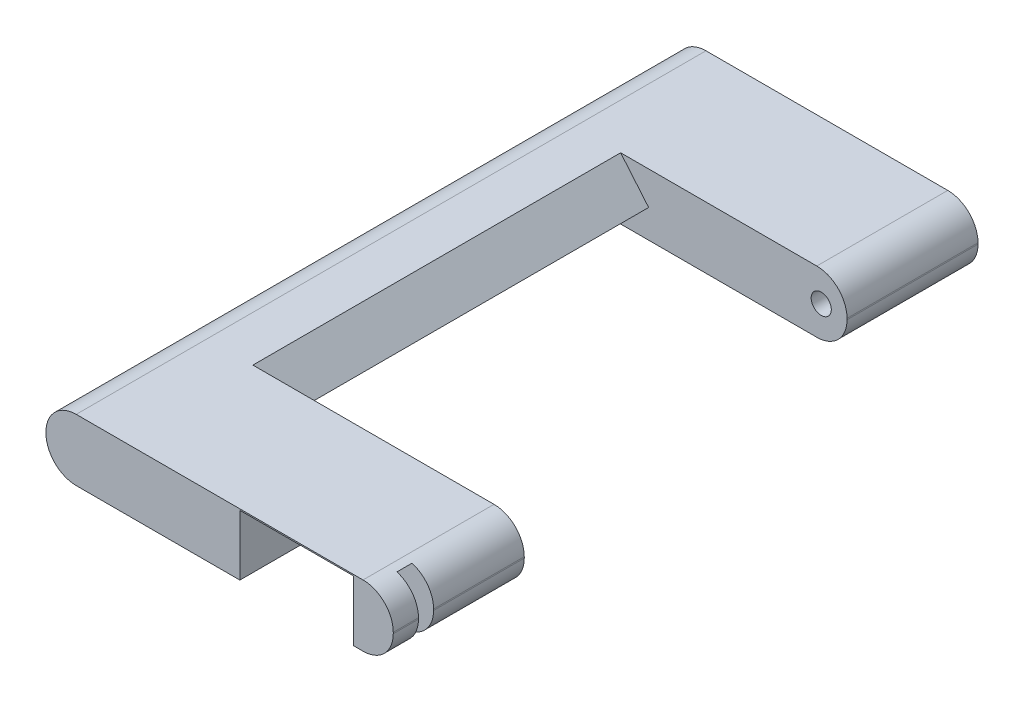
ISO-10303-21;
HEADER;
FILE_DESCRIPTION(('STEP AP214'),'2;1');
FILE_NAME('part.step','',(''),(''),'','','');
FILE_SCHEMA(('AUTOMOTIVE_DESIGN { 1 0 10303 214 1 1 1 1 }'));
ENDSEC;
DATA;
#1=APPLICATION_CONTEXT('core data for automotive mechanical design processes');
#2=APPLICATION_PROTOCOL_DEFINITION('international standard','automotive_design',2000,#1);
#3=PRODUCT_CONTEXT('',#1,'mechanical');
#4=PRODUCT('Part','Part','',(#3));
#5=PRODUCT_RELATED_PRODUCT_CATEGORY('part','',(#4));
#6=PRODUCT_DEFINITION_FORMATION('','',#4);
#7=PRODUCT_DEFINITION_CONTEXT('part definition',#1,'design');
#8=PRODUCT_DEFINITION('design','',#6,#7);
#9=PRODUCT_DEFINITION_SHAPE('','',#8);
#10=(LENGTH_UNIT() NAMED_UNIT(*) SI_UNIT(.MILLI.,.METRE.));
#11=(NAMED_UNIT(*) PLANE_ANGLE_UNIT() SI_UNIT($,.RADIAN.));
#12=(NAMED_UNIT(*) SI_UNIT($,.STERADIAN.) SOLID_ANGLE_UNIT());
#13=UNCERTAINTY_MEASURE_WITH_UNIT(LENGTH_MEASURE(1.E-05),#10,'distance_accuracy_value','');
#14=(GEOMETRIC_REPRESENTATION_CONTEXT(3) GLOBAL_UNCERTAINTY_ASSIGNED_CONTEXT((#13)) GLOBAL_UNIT_ASSIGNED_CONTEXT((#10,
#11,#12)) REPRESENTATION_CONTEXT('',''));
#15=CARTESIAN_POINT('',(0.,0.,0.));
#16=DIRECTION('',(0.,0.,1.));
#17=DIRECTION('',(1.,0.,0.));
#18=AXIS2_PLACEMENT_3D('',#15,#16,#17);
#19=CARTESIAN_POINT('',(19.1500000000003,6.05000000000089,-9.00000000000002));
#20=DIRECTION('',(-1.,0.,0.));
#21=DIRECTION('',(0.,0.,1.));
#22=AXIS2_PLACEMENT_3D('',#19,#20,#21);
#23=PLANE('',#22);
#24=DIRECTION('',(0.,0.,1.));
#25=VECTOR('',#24,1.);
#26=CARTESIAN_POINT('',(19.1500000000003,-0.203553390593287,-9.00000000000002));
#27=LINE('',#26,#25);
#28=CARTESIAN_POINT('',(19.1500000000003,-0.203553390593287,17.));
#29=VERTEX_POINT('',#28);
#30=CARTESIAN_POINT('',(19.1500000000003,-0.203553390593286,12.0000000000001));
#31=VERTEX_POINT('',#30);
#32=EDGE_CURVE('E350',#29,#31,#27,.F.);
#33=ORIENTED_EDGE('',*,*,#32,.T.);
#34=DIRECTION('',(0.,-1.,0.));
#35=VECTOR('',#34,1.);
#36=CARTESIAN_POINT('',(19.1500000000003,5.79644660940673,12.0000000000001));
#37=LINE('',#36,#35);
#38=CARTESIAN_POINT('',(19.1500000000003,0.0500000000008887,12.0000000000001));
#39=VERTEX_POINT('',#38);
#40=EDGE_CURVE('E257',#39,#31,#37,.T.);
#41=ORIENTED_EDGE('',*,*,#40,.F.);
#42=DIRECTION('',(0.,0.,1.));
#43=VECTOR('',#42,1.);
#44=CARTESIAN_POINT('',(19.1500000000003,0.0500000000008879,17.));
#45=LINE('',#44,#43);
#46=CARTESIAN_POINT('',(19.1500000000003,0.0500000000008879,17.));
#47=VERTEX_POINT('',#46);
#48=EDGE_CURVE('E353',#39,#47,#45,.T.);
#49=ORIENTED_EDGE('',*,*,#48,.T.);
#50=DIRECTION('',(0.,-1.,0.));
#51=VECTOR('',#50,1.);
#52=CARTESIAN_POINT('',(19.1500000000003,6.05000000000089,17.));
#53=LINE('',#52,#51);
#54=EDGE_CURVE('E292',#47,#29,#53,.T.);
#55=ORIENTED_EDGE('',*,*,#54,.T.);
#56=EDGE_LOOP('',(#33,#41,#49,#55));
#57=FACE_BOUND('',#56,.T.);
#58=ADVANCED_FACE('F32',(#57),#23,.F.);
#59=CARTESIAN_POINT('',(19.1500000000003,-6.20355339059329,-9.00000000000002));
#60=DIRECTION('',(0.,1.,0.));
#61=DIRECTION('',(-1.,0.,0.));
#62=AXIS2_PLACEMENT_3D('',#59,#60,#61);
#63=PLANE('',#62);
#64=DIRECTION('',(-1.,0.,0.));
#65=VECTOR('',#64,1.);
#66=CARTESIAN_POINT('',(19.1500000000003,-6.20355339059329,17.));
#67=LINE('',#66,#65);
#68=CARTESIAN_POINT('',(13.1500000000003,-6.20355339059329,17.));
#69=VERTEX_POINT('',#68);
#70=CARTESIAN_POINT('',(11.3000000000003,-6.20355339059329,17.));
#71=VERTEX_POINT('',#70);
#72=EDGE_CURVE('E296',#69,#71,#67,.T.);
#73=ORIENTED_EDGE('',*,*,#72,.T.);
#74=DIRECTION('',(0.,0.,1.));
#75=VECTOR('',#74,1.);
#76=CARTESIAN_POINT('',(11.3000000000003,-6.20355339059329,12.0000000000001));
#77=LINE('',#76,#75);
#78=CARTESIAN_POINT('',(11.3000000000003,-6.20355339059329,12.0000000000001));
#79=VERTEX_POINT('',#78);
#80=EDGE_CURVE('E227',#79,#71,#77,.T.);
#81=ORIENTED_EDGE('',*,*,#80,.F.);
#82=DIRECTION('',(-1.,0.,0.));
#83=VECTOR('',#82,1.);
#84=CARTESIAN_POINT('',(11.3000000000003,-6.20355339059329,12.0000000000001));
#85=LINE('',#84,#83);
#86=CARTESIAN_POINT('',(13.1500000000003,-6.20355339059329,12.0000000000001));
#87=VERTEX_POINT('',#86);
#88=EDGE_CURVE('E243',#87,#79,#85,.T.);
#89=ORIENTED_EDGE('',*,*,#88,.F.);
#90=DIRECTION('',(0.,0.,1.));
#91=VECTOR('',#90,1.);
#92=CARTESIAN_POINT('',(13.1500000000003,-6.20355339059329,-9.00000000000002));
#93=LINE('',#92,#91);
#94=EDGE_CURVE('E384',#87,#69,#93,.T.);
#95=ORIENTED_EDGE('',*,*,#94,.T.);
#96=EDGE_LOOP('',(#73,#81,#89,#95));
#97=FACE_BOUND('',#96,.T.);
#98=ADVANCED_FACE('F400',(#97),#63,.F.);
#99=CARTESIAN_POINT('',(13.1500000000003,-0.203553390593288,-9.00000000000002));
#100=DIRECTION('',(0.,0.,1.));
#101=DIRECTION('',(1.,0.,0.));
#102=AXIS2_PLACEMENT_3D('',#99,#100,#101);
#103=CYLINDRICAL_SURFACE('',#102,6.);
#104=CARTESIAN_POINT('',(13.1500000000003,-0.203553390593288,12.0000000000001));
#105=DIRECTION('',(0.,0.,1.));
#106=DIRECTION('',(1.,0.,0.));
#107=AXIS2_PLACEMENT_3D('',#104,#105,#106);
#108=CIRCLE('',#107,6.);
#109=EDGE_CURVE('E40',#31,#87,#108,.F.);
#110=ORIENTED_EDGE('',*,*,#109,.F.);
#111=ORIENTED_EDGE('',*,*,#32,.F.);
#112=CARTESIAN_POINT('',(13.1500000000003,-0.203553390593288,17.));
#113=DIRECTION('',(0.,0.,-1.));
#114=DIRECTION('',(-1.,0.,0.));
#115=AXIS2_PLACEMENT_3D('',#112,#113,#114);
#116=CIRCLE('',#115,6.);
#117=EDGE_CURVE('E357',#69,#29,#116,.F.);
#118=ORIENTED_EDGE('',*,*,#117,.F.);
#119=ORIENTED_EDGE('',*,*,#94,.F.);
#120=EDGE_LOOP('',(#110,#111,#118,#119));
#121=FACE_BOUND('',#120,.T.);
#122=ADVANCED_FACE('F402',(#121),#103,.T.);
#123=CARTESIAN_POINT('',(19.1500000000003,0.0500000000008879,-9.00000000000002));
#124=VERTEX_POINT('',#123);
#125=CARTESIAN_POINT('',(19.1500000000003,0.050000000000889,9.00000000000006));
#126=VERTEX_POINT('',#125);
#127=EDGE_CURVE('E354',#124,#126,#45,.T.);
#128=ORIENTED_EDGE('',*,*,#127,.T.);
#129=DIRECTION('',(0.,-1.,0.));
#130=VECTOR('',#129,1.);
#131=CARTESIAN_POINT('',(19.1500000000003,5.79644660940673,9.00000000000006));
#132=LINE('',#131,#130);
#133=CARTESIAN_POINT('',(19.1500000000003,-0.203553390593286,9.00000000000006));
#134=VERTEX_POINT('',#133);
#135=EDGE_CURVE('E259',#126,#134,#132,.T.);
#136=ORIENTED_EDGE('',*,*,#135,.T.);
#137=CARTESIAN_POINT('',(19.1500000000003,-0.203553390593287,-9.00000000000002));
#138=VERTEX_POINT('',#137);
#139=EDGE_CURVE('E347',#134,#138,#27,.F.);
#140=ORIENTED_EDGE('',*,*,#139,.T.);
#141=DIRECTION('',(0.,-1.,0.));
#142=VECTOR('',#141,1.);
#143=CARTESIAN_POINT('',(19.1500000000003,6.05000000000089,-9.00000000000002));
#144=LINE('',#143,#142);
#145=EDGE_CURVE('E304',#124,#138,#144,.T.);
#146=ORIENTED_EDGE('',*,*,#145,.F.);
#147=EDGE_LOOP('',(#128,#136,#140,#146));
#148=FACE_BOUND('',#147,.T.);
#149=ADVANCED_FACE('F436',(#148),#23,.F.);
#150=DIRECTION('',(1.,0.,0.));
#151=VECTOR('',#150,1.);
#152=CARTESIAN_POINT('',(-11.2999999999997,-6.20355339059329,0.0500000000000604));
#153=LINE('',#152,#151);
#154=CARTESIAN_POINT('',(-11.2999999999997,-6.20355339059329,0.0500000000000604));
#155=VERTEX_POINT('',#154);
#156=CARTESIAN_POINT('',(11.3000000000003,-6.20355339059329,0.0500000000000604));
#157=VERTEX_POINT('',#156);
#158=EDGE_CURVE('E207',#155,#157,#153,.T.);
#159=ORIENTED_EDGE('',*,*,#158,.F.);
#160=DIRECTION('',(0.,0.,-1.));
#161=VECTOR('',#160,1.);
#162=CARTESIAN_POINT('',(-11.2999999999997,-6.20355339059329,0.0500000000000604));
#163=LINE('',#162,#161);
#164=CARTESIAN_POINT('',(-11.2999999999997,-6.20355339059329,17.));
#165=VERTEX_POINT('',#164);
#166=EDGE_CURVE('E224',#165,#155,#163,.T.);
#167=ORIENTED_EDGE('',*,*,#166,.F.);
#168=CARTESIAN_POINT('',(-43.7830753809281,-6.2035533905933,17.));
#169=VERTEX_POINT('',#168);
#170=EDGE_CURVE('E295',#165,#169,#67,.T.);
#171=ORIENTED_EDGE('',*,*,#170,.T.);
#172=DIRECTION('',(0.,0.,1.));
#173=VECTOR('',#172,1.);
#174=CARTESIAN_POINT('',(-43.7830753809281,-6.2035533905933,-108.));
#175=LINE('',#174,#173);
#176=CARTESIAN_POINT('',(-43.7830753809281,-6.2035533905933,-108.));
#177=VERTEX_POINT('',#176);
#178=EDGE_CURVE('E328',#169,#177,#175,.F.);
#179=ORIENTED_EDGE('',*,*,#178,.T.);
#180=DIRECTION('',(-1.,0.,0.));
#181=VECTOR('',#180,1.);
#182=CARTESIAN_POINT('',(-49.7830753809281,-6.2035533905933,-108.));
#183=LINE('',#182,#181);
#184=CARTESIAN_POINT('',(4.21692461907189,-6.20355339059331,-108.));
#185=VERTEX_POINT('',#184);
#186=EDGE_CURVE('E287',#185,#177,#183,.T.);
#187=ORIENTED_EDGE('',*,*,#186,.F.);
#188=DIRECTION('',(0.,0.,-1.));
#189=VECTOR('',#188,1.);
#190=CARTESIAN_POINT('',(4.21692461907189,-6.20355339059329,-82.0000000000001));
#191=LINE('',#190,#189);
#192=CARTESIAN_POINT('',(4.21692461907189,-6.20355339059331,-82.0000000000001));
#193=VERTEX_POINT('',#192);
#194=EDGE_CURVE('E55',#185,#193,#191,.F.);
#195=ORIENTED_EDGE('',*,*,#194,.T.);
#196=DIRECTION('',(-1.,0.,0.));
#197=VECTOR('',#196,1.);
#198=CARTESIAN_POINT('',(-49.7830753809281,-6.2035533905933,-82.0000000000001));
#199=LINE('',#198,#197);
#200=CARTESIAN_POINT('',(-35.8687459222912,-6.2035533905933,-82.0000000000001));
#201=VERTEX_POINT('',#200);
#202=EDGE_CURVE('E280',#193,#201,#199,.T.);
#203=ORIENTED_EDGE('',*,*,#202,.T.);
#204=DIRECTION('',(0.,0.,1.));
#205=VECTOR('',#204,1.);
#206=CARTESIAN_POINT('',(-35.8687459222912,-6.2035533905933,-9.00000000000002));
#207=LINE('',#206,#205);
#208=CARTESIAN_POINT('',(-35.8687459222912,-6.2035533905933,-9.00000000000002));
#209=VERTEX_POINT('',#208);
#210=EDGE_CURVE('E331',#201,#209,#207,.T.);
#211=ORIENTED_EDGE('',*,*,#210,.T.);
#212=DIRECTION('',(-1.,0.,0.));
#213=VECTOR('',#212,1.);
#214=CARTESIAN_POINT('',(19.1500000000003,-6.20355339059329,-9.00000000000002));
#215=LINE('',#214,#213);
#216=CARTESIAN_POINT('',(13.1500000000003,-6.20355339059329,-9.00000000000002));
#217=VERTEX_POINT('',#216);
#218=EDGE_CURVE('E307',#217,#209,#215,.T.);
#219=ORIENTED_EDGE('',*,*,#218,.F.);
#220=CARTESIAN_POINT('',(13.1500000000003,-6.20355339059329,9.00000000000006));
#221=VERTEX_POINT('',#220);
#222=EDGE_CURVE('E385',#217,#221,#93,.T.);
#223=ORIENTED_EDGE('',*,*,#222,.T.);
#224=DIRECTION('',(1.,0.,0.));
#225=VECTOR('',#224,1.);
#226=CARTESIAN_POINT('',(11.3000000000003,-6.20355339059329,9.00000000000006));
#227=LINE('',#226,#225);
#228=CARTESIAN_POINT('',(11.3000000000003,-6.20355339059329,9.00000000000006));
#229=VERTEX_POINT('',#228);
#230=EDGE_CURVE('E47',#229,#221,#227,.T.);
#231=ORIENTED_EDGE('',*,*,#230,.F.);
#232=DIRECTION('',(0.,0.,1.));
#233=VECTOR('',#232,1.);
#234=CARTESIAN_POINT('',(11.3000000000003,-6.20355339059329,0.0500000000000604));
#235=LINE('',#234,#233);
#236=EDGE_CURVE('E240',#157,#229,#235,.T.);
#237=ORIENTED_EDGE('',*,*,#236,.F.);
#238=EDGE_LOOP('',(#159,#167,#171,#179,#187,#195,#203,#211,#219,#223,#231,#237));
#239=FACE_BOUND('',#238,.T.);
#240=ADVANCED_FACE('F443',(#239),#63,.F.);
#241=CARTESIAN_POINT('',(-49.7830753809281,6.05000000000088,-9.00000000000002));
#242=DIRECTION('',(-1.,0.,0.));
#243=DIRECTION('',(0.,0.,1.));
#244=AXIS2_PLACEMENT_3D('',#241,#242,#243);
#245=PLANE('',#244);
#246=DIRECTION('',(0.,-1.,0.));
#247=VECTOR('',#246,1.);
#248=CARTESIAN_POINT('',(-49.7830753809281,6.05000000000088,17.));
#249=LINE('',#248,#247);
#250=CARTESIAN_POINT('',(-49.7830753809281,0.0500000000008775,17.));
#251=VERTEX_POINT('',#250);
#252=CARTESIAN_POINT('',(-49.7830753809281,-0.203553390593299,17.));
#253=VERTEX_POINT('',#252);
#254=EDGE_CURVE('E299',#251,#253,#249,.T.);
#255=ORIENTED_EDGE('',*,*,#254,.F.);
#256=DIRECTION('',(0.,0.,1.));
#257=VECTOR('',#256,1.);
#258=CARTESIAN_POINT('',(-49.7830753809281,0.0500000000008775,-9.00000000000002));
#259=LINE('',#258,#257);
#260=CARTESIAN_POINT('',(-49.7830753809281,0.0500000000008775,-108.));
#261=VERTEX_POINT('',#260);
#262=EDGE_CURVE('E322',#251,#261,#259,.F.);
#263=ORIENTED_EDGE('',*,*,#262,.T.);
#264=DIRECTION('',(0.,1.,0.));
#265=VECTOR('',#264,1.);
#266=CARTESIAN_POINT('',(-49.7830753809281,6.05000000000088,-108.));
#267=LINE('',#266,#265);
#268=CARTESIAN_POINT('',(-49.7830753809281,-0.203553390593299,-108.));
#269=VERTEX_POINT('',#268);
#270=EDGE_CURVE('E289',#269,#261,#267,.T.);
#271=ORIENTED_EDGE('',*,*,#270,.F.);
#272=DIRECTION('',(0.,0.,1.));
#273=VECTOR('',#272,1.);
#274=CARTESIAN_POINT('',(-49.7830753809281,-0.203553390593299,17.));
#275=LINE('',#274,#273);
#276=EDGE_CURVE('E319',#269,#253,#275,.T.);
#277=ORIENTED_EDGE('',*,*,#276,.T.);
#278=EDGE_LOOP('',(#255,#263,#271,#277));
#279=FACE_BOUND('',#278,.T.);
#280=ADVANCED_FACE('F479',(#279),#245,.T.);
#281=CARTESIAN_POINT('',(19.1500000000003,6.05000000000089,-9.00000000000002));
#282=DIRECTION('',(0.,1.,0.));
#283=DIRECTION('',(-1.,0.,0.));
#284=AXIS2_PLACEMENT_3D('',#281,#282,#283);
#285=PLANE('',#284);
#286=DIRECTION('',(-1.,0.,0.));
#287=VECTOR('',#286,1.);
#288=CARTESIAN_POINT('',(19.1500000000003,6.05000000000089,17.));
#289=LINE('',#288,#287);
#290=CARTESIAN_POINT('',(13.1500000000003,6.05000000000089,17.));
#291=VERTEX_POINT('',#290);
#292=CARTESIAN_POINT('',(-43.7830753809281,6.05000000000088,17.));
#293=VERTEX_POINT('',#292);
#294=EDGE_CURVE('E302',#291,#293,#289,.T.);
#295=ORIENTED_EDGE('',*,*,#294,.F.);
#296=DIRECTION('',(0.,0.,1.));
#297=VECTOR('',#296,1.);
#298=CARTESIAN_POINT('',(13.1500000000003,6.05000000000089,-9.00000000000002));
#299=LINE('',#298,#297);
#300=CARTESIAN_POINT('',(13.1500000000003,6.05000000000089,-9.00000000000002));
#301=VERTEX_POINT('',#300);
#302=EDGE_CURVE('E364',#291,#301,#299,.F.);
#303=ORIENTED_EDGE('',*,*,#302,.T.);
#304=DIRECTION('',(-1.,0.,0.));
#305=VECTOR('',#304,1.);
#306=CARTESIAN_POINT('',(19.1500000000003,6.05000000000089,-9.00000000000002));
#307=LINE('',#306,#305);
#308=CARTESIAN_POINT('',(-34.718224366726,6.05000000000088,-9.00000000000002));
#309=VERTEX_POINT('',#308);
#310=EDGE_CURVE('E309',#301,#309,#307,.T.);
#311=ORIENTED_EDGE('',*,*,#310,.T.);
#312=DIRECTION('',(0.,0.,-1.));
#313=VECTOR('',#312,1.);
#314=CARTESIAN_POINT('',(-34.718224366726,6.05000000000088,-82.0000000000001));
#315=LINE('',#314,#313);
#316=CARTESIAN_POINT('',(-34.718224366726,6.05000000000087,-82.0000000000001));
#317=VERTEX_POINT('',#316);
#318=EDGE_CURVE('E334',#309,#317,#315,.T.);
#319=ORIENTED_EDGE('',*,*,#318,.T.);
#320=DIRECTION('',(1.,0.,0.));
#321=VECTOR('',#320,1.);
#322=CARTESIAN_POINT('',(-49.7830753809281,6.05000000000088,-82.0000000000001));
#323=LINE('',#322,#321);
#324=CARTESIAN_POINT('',(4.21692461907189,6.05000000000087,-82.0000000000001));
#325=VERTEX_POINT('',#324);
#326=EDGE_CURVE('E273',#317,#325,#323,.T.);
#327=ORIENTED_EDGE('',*,*,#326,.T.);
#328=DIRECTION('',(0.,0.,-1.));
#329=VECTOR('',#328,1.);
#330=CARTESIAN_POINT('',(4.21692461907189,6.05000000000089,-9.00000000000002));
#331=LINE('',#330,#329);
#332=CARTESIAN_POINT('',(4.21692461907189,6.05000000000087,-108.));
#333=VERTEX_POINT('',#332);
#334=EDGE_CURVE('E361',#325,#333,#331,.T.);
#335=ORIENTED_EDGE('',*,*,#334,.T.);
#336=DIRECTION('',(1.,0.,0.));
#337=VECTOR('',#336,1.);
#338=CARTESIAN_POINT('',(-49.7830753809281,6.05000000000088,-108.));
#339=LINE('',#338,#337);
#340=CARTESIAN_POINT('',(-43.7830753809281,6.05000000000088,-108.));
#341=VERTEX_POINT('',#340);
#342=EDGE_CURVE('E282',#341,#333,#339,.T.);
#343=ORIENTED_EDGE('',*,*,#342,.F.);
#344=DIRECTION('',(0.,0.,1.));
#345=VECTOR('',#344,1.);
#346=CARTESIAN_POINT('',(-43.7830753809281,6.05000000000088,-9.00000000000002));
#347=LINE('',#346,#345);
#348=EDGE_CURVE('E311',#341,#293,#347,.T.);
#349=ORIENTED_EDGE('',*,*,#348,.T.);
#350=EDGE_LOOP('',(#295,#303,#311,#319,#327,#335,#343,#349));
#351=FACE_BOUND('',#350,.T.);
#352=ADVANCED_FACE('F425',(#351),#285,.T.);
#353=CARTESIAN_POINT('',(0.,0.,-9.00000000000002));
#354=DIRECTION('',(0.,0.,-1.));
#355=DIRECTION('',(-1.,0.,0.));
#356=AXIS2_PLACEMENT_3D('',#353,#354,#355);
#357=PLANE('',#356);
#358=ORIENTED_EDGE('',*,*,#310,.F.);
#359=CARTESIAN_POINT('',(13.1500000000003,0.0500000000008879,-9.00000000000002));
#360=DIRECTION('',(0.,0.,-1.));
#361=DIRECTION('',(-1.,0.,0.));
#362=AXIS2_PLACEMENT_3D('',#359,#360,#361);
#363=CIRCLE('',#362,6.);
#364=EDGE_CURVE('E368',#301,#124,#363,.T.);
#365=ORIENTED_EDGE('',*,*,#364,.T.);
#366=ORIENTED_EDGE('',*,*,#145,.T.);
#367=CARTESIAN_POINT('',(13.1500000000003,-0.203553390593288,-9.00000000000002));
#368=DIRECTION('',(0.,0.,-1.));
#369=DIRECTION('',(-1.,0.,0.));
#370=AXIS2_PLACEMENT_3D('',#367,#368,#369);
#371=CIRCLE('',#370,6.);
#372=EDGE_CURVE('E366',#138,#217,#371,.T.);
#373=ORIENTED_EDGE('',*,*,#372,.T.);
#374=ORIENTED_EDGE('',*,*,#218,.T.);
#375=DIRECTION('',(-0.766044443118976,-0.642787609686541,0.));
#376=VECTOR('',#375,1.);
#377=CARTESIAN_POINT('',(-35.8687459222912,-6.2035533905933,-9.00000000000002));
#378=LINE('',#377,#376);
#379=CARTESIAN_POINT('',(-29.1598949682603,-0.574159029442596,-9.00000000000002));
#380=VERTEX_POINT('',#379);
#381=EDGE_CURVE('E337',#209,#380,#378,.F.);
#382=ORIENTED_EDGE('',*,*,#381,.T.);
#383=DIRECTION('',(-0.642787609686541,0.766044443118976,0.));
#384=VECTOR('',#383,1.);
#385=CARTESIAN_POINT('',(-28.718224366726,-1.10052155556437,-9.00000000000002));
#386=LINE('',#385,#384);
#387=EDGE_CURVE('E342',#380,#309,#386,.T.);
#388=ORIENTED_EDGE('',*,*,#387,.T.);
#389=EDGE_LOOP('',(#358,#365,#366,#373,#374,#382,#388));
#390=FACE_BOUND('',#389,.T.);
#391=ADVANCED_FACE('F433',(#390),#357,.T.);
#392=CARTESIAN_POINT('',(0.,0.,17.));
#393=DIRECTION('',(0.,0.,-1.));
#394=DIRECTION('',(-1.,0.,0.));
#395=AXIS2_PLACEMENT_3D('',#392,#393,#394);
#396=PLANE('',#395);
#397=ORIENTED_EDGE('',*,*,#170,.F.);
#398=DIRECTION('',(0.,-1.,0.));
#399=VECTOR('',#398,1.);
#400=CARTESIAN_POINT('',(-11.2999999999997,5.79644660940673,17.));
#401=LINE('',#400,#399);
#402=CARTESIAN_POINT('',(-11.2999999999997,5.79644660940673,17.));
#403=VERTEX_POINT('',#402);
#404=EDGE_CURVE('E249',#403,#165,#401,.T.);
#405=ORIENTED_EDGE('',*,*,#404,.F.);
#406=DIRECTION('',(-1.,0.,0.));
#407=VECTOR('',#406,1.);
#408=CARTESIAN_POINT('',(-11.2999999999997,5.79644660940673,17.));
#409=LINE('',#408,#407);
#410=CARTESIAN_POINT('',(11.3000000000003,5.79644660940673,17.));
#411=VERTEX_POINT('',#410);
#412=EDGE_CURVE('E236',#411,#403,#409,.T.);
#413=ORIENTED_EDGE('',*,*,#412,.F.);
#414=DIRECTION('',(0.,-1.,0.));
#415=VECTOR('',#414,1.);
#416=CARTESIAN_POINT('',(11.3000000000003,5.79644660940673,17.));
#417=LINE('',#416,#415);
#418=EDGE_CURVE('E251',#411,#71,#417,.T.);
#419=ORIENTED_EDGE('',*,*,#418,.T.);
#420=ORIENTED_EDGE('',*,*,#72,.F.);
#421=ORIENTED_EDGE('',*,*,#117,.T.);
#422=ORIENTED_EDGE('',*,*,#54,.F.);
#423=CARTESIAN_POINT('',(13.1500000000003,0.0500000000008879,17.));
#424=DIRECTION('',(0.,0.,-1.));
#425=DIRECTION('',(-1.,0.,0.));
#426=AXIS2_PLACEMENT_3D('',#423,#424,#425);
#427=CIRCLE('',#426,6.);
#428=EDGE_CURVE('E359',#47,#291,#427,.F.);
#429=ORIENTED_EDGE('',*,*,#428,.T.);
#430=ORIENTED_EDGE('',*,*,#294,.T.);
#431=CARTESIAN_POINT('',(-43.7830753809281,0.0500000000008777,17.));
#432=DIRECTION('',(0.,0.,-1.));
#433=DIRECTION('',(-1.,0.,0.));
#434=AXIS2_PLACEMENT_3D('',#431,#432,#433);
#435=CIRCLE('',#434,6.);
#436=EDGE_CURVE('E317',#293,#251,#435,.F.);
#437=ORIENTED_EDGE('',*,*,#436,.T.);
#438=ORIENTED_EDGE('',*,*,#254,.T.);
#439=CARTESIAN_POINT('',(-43.7830753809281,-0.203553390593299,17.));
#440=DIRECTION('',(0.,0.,-1.));
#441=DIRECTION('',(-1.,0.,0.));
#442=AXIS2_PLACEMENT_3D('',#439,#440,#441);
#443=CIRCLE('',#442,6.);
#444=EDGE_CURVE('E314',#253,#169,#443,.F.);
#445=ORIENTED_EDGE('',*,*,#444,.T.);
#446=EDGE_LOOP('',(#397,#405,#413,#419,#420,#421,#422,#429,#430,#437,#438,#445));
#447=FACE_BOUND('',#446,.T.);
#448=ADVANCED_FACE('F407',(#447),#396,.F.);
#449=CARTESIAN_POINT('',(0.,0.,-108.));
#450=DIRECTION('',(0.,0.,-1.));
#451=DIRECTION('',(-1.,0.,0.));
#452=AXIS2_PLACEMENT_3D('',#449,#450,#451);
#453=PLANE('',#452);
#454=CARTESIAN_POINT('',(5.10000000000026,0.,-108.));
#455=DIRECTION('',(0.,0.,-1.));
#456=DIRECTION('',(-1.,0.,0.));
#457=AXIS2_PLACEMENT_3D('',#454,#455,#456);
#458=CIRCLE('',#457,2.00000000000025);
#459=CARTESIAN_POINT('',(3.10000000000001,0.,-108.));
#460=VERTEX_POINT('',#459);
#461=EDGE_CURVE('E269',#460,#460,#458,.T.);
#462=ORIENTED_EDGE('',*,*,#461,.F.);
#463=EDGE_LOOP('',(#462));
#464=FACE_BOUND('',#463,.T.);
#465=ORIENTED_EDGE('',*,*,#342,.T.);
#466=CARTESIAN_POINT('',(4.21692461907189,0.0500000000008861,-108.));
#467=DIRECTION('',(0.,0.,-1.));
#468=DIRECTION('',(-1.,0.,0.));
#469=AXIS2_PLACEMENT_3D('',#466,#467,#468);
#470=CIRCLE('',#469,6.);
#471=CARTESIAN_POINT('',(10.2169246190719,0.0500000000008853,-108.));
#472=VERTEX_POINT('',#471);
#473=EDGE_CURVE('E372',#333,#472,#470,.T.);
#474=ORIENTED_EDGE('',*,*,#473,.T.);
#475=DIRECTION('',(0.,-1.,0.));
#476=VECTOR('',#475,1.);
#477=CARTESIAN_POINT('',(10.2169246190719,6.05000000000087,-108.));
#478=LINE('',#477,#476);
#479=CARTESIAN_POINT('',(10.2169246190719,-0.20355339059329,-108.));
#480=VERTEX_POINT('',#479);
#481=EDGE_CURVE('E277',#472,#480,#478,.T.);
#482=ORIENTED_EDGE('',*,*,#481,.T.);
#483=CARTESIAN_POINT('',(4.21692461907189,-0.203553390593289,-108.));
#484=DIRECTION('',(0.,0.,-1.));
#485=DIRECTION('',(-1.,0.,0.));
#486=AXIS2_PLACEMENT_3D('',#483,#484,#485);
#487=CIRCLE('',#486,6.);
#488=EDGE_CURVE('E370',#480,#185,#487,.T.);
#489=ORIENTED_EDGE('',*,*,#488,.T.);
#490=ORIENTED_EDGE('',*,*,#186,.T.);
#491=CARTESIAN_POINT('',(-43.7830753809281,-0.203553390593299,-108.));
#492=DIRECTION('',(0.,0.,-1.));
#493=DIRECTION('',(-1.,0.,0.));
#494=AXIS2_PLACEMENT_3D('',#491,#492,#493);
#495=CIRCLE('',#494,6.);
#496=EDGE_CURVE('E324',#177,#269,#495,.T.);
#497=ORIENTED_EDGE('',*,*,#496,.T.);
#498=ORIENTED_EDGE('',*,*,#270,.T.);
#499=CARTESIAN_POINT('',(-43.7830753809281,0.0500000000008777,-108.));
#500=DIRECTION('',(0.,0.,-1.));
#501=DIRECTION('',(-1.,0.,0.));
#502=AXIS2_PLACEMENT_3D('',#499,#500,#501);
#503=CIRCLE('',#502,6.);
#504=EDGE_CURVE('E326',#261,#341,#503,.T.);
#505=ORIENTED_EDGE('',*,*,#504,.T.);
#506=EDGE_LOOP('',(#465,#474,#482,#489,#490,#497,#498,#505));
#507=FACE_BOUND('',#506,.T.);
#508=ADVANCED_FACE('F462',(#464,#507),#453,.T.);
#509=CARTESIAN_POINT('',(0.,0.,-82.0000000000001));
#510=DIRECTION('',(0.,0.,-1.));
#511=DIRECTION('',(-1.,0.,0.));
#512=AXIS2_PLACEMENT_3D('',#509,#510,#511);
#513=PLANE('',#512);
#514=CARTESIAN_POINT('',(5.10000000000026,0.,-82.0000000000001));
#515=DIRECTION('',(0.,0.,-1.));
#516=DIRECTION('',(-1.,0.,0.));
#517=AXIS2_PLACEMENT_3D('',#514,#515,#516);
#518=CIRCLE('',#517,2.00000000000025);
#519=CARTESIAN_POINT('',(3.10000000000001,0.,-82.0000000000001));
#520=VERTEX_POINT('',#519);
#521=EDGE_CURVE('E266',#520,#520,#518,.F.);
#522=ORIENTED_EDGE('',*,*,#521,.F.);
#523=EDGE_LOOP('',(#522));
#524=FACE_BOUND('',#523,.T.);
#525=DIRECTION('',(0.,-1.,0.));
#526=VECTOR('',#525,1.);
#527=CARTESIAN_POINT('',(10.2169246190719,6.05000000000087,-82.0000000000001));
#528=LINE('',#527,#526);
#529=CARTESIAN_POINT('',(10.2169246190719,0.0500000000008853,-82.0000000000001));
#530=VERTEX_POINT('',#529);
#531=CARTESIAN_POINT('',(10.2169246190719,-0.20355339059329,-82.0000000000001));
#532=VERTEX_POINT('',#531);
#533=EDGE_CURVE('E276',#530,#532,#528,.T.);
#534=ORIENTED_EDGE('',*,*,#533,.F.);
#535=CARTESIAN_POINT('',(4.21692461907189,0.0500000000008861,-82.0000000000001));
#536=DIRECTION('',(0.,0.,-1.));
#537=DIRECTION('',(-1.,0.,0.));
#538=AXIS2_PLACEMENT_3D('',#535,#536,#537);
#539=CIRCLE('',#538,6.);
#540=EDGE_CURVE('E381',#530,#325,#539,.F.);
#541=ORIENTED_EDGE('',*,*,#540,.T.);
#542=ORIENTED_EDGE('',*,*,#326,.F.);
#543=DIRECTION('',(0.642787609686541,-0.766044443118976,0.));
#544=VECTOR('',#543,1.);
#545=CARTESIAN_POINT('',(-17.3944469270573,-14.5956740010267,-82.0000000000001));
#546=LINE('',#545,#544);
#547=CARTESIAN_POINT('',(-29.1598949682603,-0.574159029442597,-82.0000000000001));
#548=VERTEX_POINT('',#547);
#549=EDGE_CURVE('E345',#317,#548,#546,.T.);
#550=ORIENTED_EDGE('',*,*,#549,.T.);
#551=DIRECTION('',(0.766044443118976,0.642787609686541,0.));
#552=VECTOR('',#551,1.);
#553=CARTESIAN_POINT('',(-11.765448041203,14.0215149715841,-82.0000000000001));
#554=LINE('',#553,#552);
#555=EDGE_CURVE('E339',#548,#201,#554,.F.);
#556=ORIENTED_EDGE('',*,*,#555,.T.);
#557=ORIENTED_EDGE('',*,*,#202,.F.);
#558=CARTESIAN_POINT('',(4.21692461907189,-0.203553390593289,-82.0000000000001));
#559=DIRECTION('',(0.,0.,-1.));
#560=DIRECTION('',(-1.,0.,0.));
#561=AXIS2_PLACEMENT_3D('',#558,#559,#560);
#562=CIRCLE('',#561,6.);
#563=EDGE_CURVE('E379',#193,#532,#562,.F.);
#564=ORIENTED_EDGE('',*,*,#563,.T.);
#565=EDGE_LOOP('',(#534,#541,#542,#550,#556,#557,#564));
#566=FACE_BOUND('',#565,.T.);
#567=ADVANCED_FACE('F529',(#524,#566),#513,.F.);
#568=CARTESIAN_POINT('',(10.2169246190719,6.05000000000087,-82.0000000000001));
#569=DIRECTION('',(1.,0.,0.));
#570=DIRECTION('',(0.,1.,0.));
#571=AXIS2_PLACEMENT_3D('',#568,#569,#570);
#572=PLANE('',#571);
#573=ORIENTED_EDGE('',*,*,#481,.F.);
#574=DIRECTION('',(0.,0.,-1.));
#575=VECTOR('',#574,1.);
#576=CARTESIAN_POINT('',(10.2169246190719,0.0500000000008853,-82.0000000000001));
#577=LINE('',#576,#575);
#578=EDGE_CURVE('E377',#472,#530,#577,.F.);
#579=ORIENTED_EDGE('',*,*,#578,.T.);
#580=ORIENTED_EDGE('',*,*,#533,.T.);
#581=DIRECTION('',(0.,0.,-1.));
#582=VECTOR('',#581,1.);
#583=CARTESIAN_POINT('',(10.2169246190719,-0.20355339059329,-108.));
#584=LINE('',#583,#582);
#585=EDGE_CURVE('E374',#532,#480,#584,.T.);
#586=ORIENTED_EDGE('',*,*,#585,.T.);
#587=EDGE_LOOP('',(#573,#579,#580,#586));
#588=FACE_BOUND('',#587,.T.);
#589=ADVANCED_FACE('F464',(#588),#572,.T.);
#590=CARTESIAN_POINT('',(-43.7830753809281,0.0500000000008777,-9.00000000000002));
#591=DIRECTION('',(0.,0.,1.));
#592=DIRECTION('',(1.,0.,0.));
#593=AXIS2_PLACEMENT_3D('',#590,#591,#592);
#594=CYLINDRICAL_SURFACE('',#593,6.);
#595=ORIENTED_EDGE('',*,*,#504,.F.);
#596=ORIENTED_EDGE('',*,*,#262,.F.);
#597=ORIENTED_EDGE('',*,*,#436,.F.);
#598=ORIENTED_EDGE('',*,*,#348,.F.);
#599=EDGE_LOOP('',(#595,#596,#597,#598));
#600=FACE_BOUND('',#599,.T.);
#601=ADVANCED_FACE('F482',(#600),#594,.T.);
#602=CARTESIAN_POINT('',(-43.7830753809281,-0.203553390593299,-9.00000000000002));
#603=DIRECTION('',(0.,0.,-1.));
#604=DIRECTION('',(-1.,0.,0.));
#605=AXIS2_PLACEMENT_3D('',#602,#603,#604);
#606=CYLINDRICAL_SURFACE('',#605,6.);
#607=ORIENTED_EDGE('',*,*,#496,.F.);
#608=ORIENTED_EDGE('',*,*,#178,.F.);
#609=ORIENTED_EDGE('',*,*,#444,.F.);
#610=ORIENTED_EDGE('',*,*,#276,.F.);
#611=EDGE_LOOP('',(#607,#608,#609,#610));
#612=FACE_BOUND('',#611,.T.);
#613=ADVANCED_FACE('F474',(#612),#606,.T.);
#614=CARTESIAN_POINT('',(-28.718224366726,-1.10052155556437,-108.));
#615=DIRECTION('',(0.766044443118976,0.642787609686541,0.));
#616=DIRECTION('',(0.,0.,-1.));
#617=AXIS2_PLACEMENT_3D('',#614,#615,#616);
#618=PLANE('',#617);
#619=DIRECTION('',(0.,0.,-1.));
#620=VECTOR('',#619,1.);
#621=CARTESIAN_POINT('',(-29.1598949682603,-0.574159029442595,-9.00000000000002));
#622=LINE('',#621,#620);
#623=EDGE_CURVE('E272',#548,#380,#622,.F.);
#624=ORIENTED_EDGE('',*,*,#623,.F.);
#625=ORIENTED_EDGE('',*,*,#549,.F.);
#626=ORIENTED_EDGE('',*,*,#318,.F.);
#627=ORIENTED_EDGE('',*,*,#387,.F.);
#628=EDGE_LOOP('',(#624,#625,#626,#627));
#629=FACE_BOUND('',#628,.T.);
#630=ADVANCED_FACE('F452',(#629),#618,.T.);
#631=CARTESIAN_POINT('',(-35.8687459222912,-6.2035533905933,-9.00000000000002));
#632=DIRECTION('',(-0.642787609686541,0.766044443118977,0.));
#633=DIRECTION('',(0.,0.,1.));
#634=AXIS2_PLACEMENT_3D('',#631,#632,#633);
#635=PLANE('',#634);
#636=ORIENTED_EDGE('',*,*,#555,.F.);
#637=ORIENTED_EDGE('',*,*,#623,.T.);
#638=ORIENTED_EDGE('',*,*,#381,.F.);
#639=ORIENTED_EDGE('',*,*,#210,.F.);
#640=EDGE_LOOP('',(#636,#637,#638,#639));
#641=FACE_BOUND('',#640,.T.);
#642=ADVANCED_FACE('F447',(#641),#635,.F.);
#643=CARTESIAN_POINT('',(5.10000000000026,0.,17.001));
#644=DIRECTION('',(0.,0.,-1.));
#645=DIRECTION('',(-1.,0.,0.));
#646=AXIS2_PLACEMENT_3D('',#643,#644,#645);
#647=CYLINDRICAL_SURFACE('',#646,2.00000000000025);
#648=ORIENTED_EDGE('',*,*,#461,.T.);
#649=EDGE_LOOP('',(#648));
#650=FACE_BOUND('',#649,.T.);
#651=ORIENTED_EDGE('',*,*,#521,.T.);
#652=EDGE_LOOP('',(#651));
#653=FACE_BOUND('',#652,.T.);
#654=ADVANCED_FACE('F517',(#650,#653),#647,.F.);
#655=CARTESIAN_POINT('',(13.1500000000003,0.0500000000008879,-9.00000000000002));
#656=DIRECTION('',(0.,0.,-1.));
#657=DIRECTION('',(-1.,0.,0.));
#658=AXIS2_PLACEMENT_3D('',#655,#656,#657);
#659=CYLINDRICAL_SURFACE('',#658,6.);
#660=CARTESIAN_POINT('',(13.1500000000003,0.0500000000008879,12.0000000000001));
#661=DIRECTION('',(0.,0.,1.));
#662=DIRECTION('',(1.,0.,0.));
#663=AXIS2_PLACEMENT_3D('',#660,#661,#662);
#664=CIRCLE('',#663,6.);
#665=CARTESIAN_POINT('',(14.8757900698663,5.79644660940673,12.0000000000001));
#666=VERTEX_POINT('',#665);
#667=EDGE_CURVE('E264',#666,#39,#664,.F.);
#668=ORIENTED_EDGE('',*,*,#667,.F.);
#669=DIRECTION('',(0.,0.,-1.));
#670=VECTOR('',#669,1.);
#671=CARTESIAN_POINT('',(14.8757900698663,5.79644660940673,-9.00000000000002));
#672=LINE('',#671,#670);
#673=CARTESIAN_POINT('',(14.8757900698663,5.79644660940673,9.00000000000006));
#674=VERTEX_POINT('',#673);
#675=EDGE_CURVE('E11',#666,#674,#672,.T.);
#676=ORIENTED_EDGE('',*,*,#675,.T.);
#677=CARTESIAN_POINT('',(13.1500000000003,0.0500000000008879,9.00000000000006));
#678=DIRECTION('',(0.,0.,-1.));
#679=DIRECTION('',(-1.,0.,0.));
#680=AXIS2_PLACEMENT_3D('',#677,#678,#679);
#681=CIRCLE('',#680,6.);
#682=EDGE_CURVE('E248',#126,#674,#681,.F.);
#683=ORIENTED_EDGE('',*,*,#682,.F.);
#684=ORIENTED_EDGE('',*,*,#127,.F.);
#685=ORIENTED_EDGE('',*,*,#364,.F.);
#686=ORIENTED_EDGE('',*,*,#302,.F.);
#687=ORIENTED_EDGE('',*,*,#428,.F.);
#688=ORIENTED_EDGE('',*,*,#48,.F.);
#689=EDGE_LOOP('',(#668,#676,#683,#684,#685,#686,#687,#688));
#690=FACE_BOUND('',#689,.T.);
#691=ADVANCED_FACE('F417',(#690),#659,.T.);
#692=CARTESIAN_POINT('',(4.21692461907189,0.0500000000008861,-9.00000000000002));
#693=DIRECTION('',(0.,0.,-1.));
#694=DIRECTION('',(-1.,0.,0.));
#695=AXIS2_PLACEMENT_3D('',#692,#693,#694);
#696=CYLINDRICAL_SURFACE('',#695,6.);
#697=ORIENTED_EDGE('',*,*,#540,.F.);
#698=ORIENTED_EDGE('',*,*,#578,.F.);
#699=ORIENTED_EDGE('',*,*,#473,.F.);
#700=ORIENTED_EDGE('',*,*,#334,.F.);
#701=EDGE_LOOP('',(#697,#698,#699,#700));
#702=FACE_BOUND('',#701,.T.);
#703=ADVANCED_FACE('F458',(#702),#696,.T.);
#704=CARTESIAN_POINT('',(13.1500000000003,-0.203553390593288,9.00000000000006));
#705=DIRECTION('',(0.,0.,-1.));
#706=DIRECTION('',(-1.,0.,0.));
#707=AXIS2_PLACEMENT_3D('',#704,#705,#706);
#708=CIRCLE('',#707,6.);
#709=EDGE_CURVE('E388',#221,#134,#708,.F.);
#710=ORIENTED_EDGE('',*,*,#709,.F.);
#711=ORIENTED_EDGE('',*,*,#222,.F.);
#712=ORIENTED_EDGE('',*,*,#372,.F.);
#713=ORIENTED_EDGE('',*,*,#139,.F.);
#714=EDGE_LOOP('',(#710,#711,#712,#713));
#715=FACE_BOUND('',#714,.T.);
#716=ADVANCED_FACE('F439',(#715),#103,.T.);
#717=CARTESIAN_POINT('',(4.21692461907189,-0.203553390593289,-82.0000000000001));
#718=DIRECTION('',(0.,0.,1.));
#719=DIRECTION('',(1.,0.,0.));
#720=AXIS2_PLACEMENT_3D('',#717,#718,#719);
#721=CYLINDRICAL_SURFACE('',#720,6.);
#722=ORIENTED_EDGE('',*,*,#563,.F.);
#723=ORIENTED_EDGE('',*,*,#194,.F.);
#724=ORIENTED_EDGE('',*,*,#488,.F.);
#725=ORIENTED_EDGE('',*,*,#585,.F.);
#726=EDGE_LOOP('',(#722,#723,#724,#725));
#727=FACE_BOUND('',#726,.T.);
#728=ADVANCED_FACE('F34',(#727),#721,.T.);
#729=CARTESIAN_POINT('',(-11.2999999999997,5.79644660940673,0.0500000000000604));
#730=DIRECTION('',(0.,0.,-1.));
#731=DIRECTION('',(-1.,0.,0.));
#732=AXIS2_PLACEMENT_3D('',#729,#730,#731);
#733=PLANE('',#732);
#734=ORIENTED_EDGE('',*,*,#158,.T.);
#735=DIRECTION('',(0.,-1.,0.));
#736=VECTOR('',#735,1.);
#737=CARTESIAN_POINT('',(11.3000000000003,5.79644660940673,0.0500000000000604));
#738=LINE('',#737,#736);
#739=CARTESIAN_POINT('',(11.3000000000003,5.79644660940673,0.0500000000000604));
#740=VERTEX_POINT('',#739);
#741=EDGE_CURVE('E200',#740,#157,#738,.T.);
#742=ORIENTED_EDGE('',*,*,#741,.F.);
#743=DIRECTION('',(1.,0.,0.));
#744=VECTOR('',#743,1.);
#745=CARTESIAN_POINT('',(-11.2999999999997,5.79644660940673,0.0500000000000604));
#746=LINE('',#745,#744);
#747=CARTESIAN_POINT('',(-11.2999999999997,5.79644660940673,0.0500000000000604));
#748=VERTEX_POINT('',#747);
#749=EDGE_CURVE('E204',#748,#740,#746,.T.);
#750=ORIENTED_EDGE('',*,*,#749,.F.);
#751=DIRECTION('',(0.,-1.,0.));
#752=VECTOR('',#751,1.);
#753=CARTESIAN_POINT('',(-11.2999999999997,5.79644660940673,0.0500000000000604));
#754=LINE('',#753,#752);
#755=EDGE_CURVE('E246',#748,#155,#754,.T.);
#756=ORIENTED_EDGE('',*,*,#755,.T.);
#757=EDGE_LOOP('',(#734,#742,#750,#756));
#758=FACE_BOUND('',#757,.T.);
#759=ADVANCED_FACE('F202',(#758),#733,.F.);
#760=CARTESIAN_POINT('',(-11.2999999999997,5.79644660940673,0.0500000000000604));
#761=DIRECTION('',(-1.,0.,0.));
#762=DIRECTION('',(0.,-1.,0.));
#763=AXIS2_PLACEMENT_3D('',#760,#761,#762);
#764=PLANE('',#763);
#765=ORIENTED_EDGE('',*,*,#166,.T.);
#766=ORIENTED_EDGE('',*,*,#755,.F.);
#767=DIRECTION('',(0.,0.,-1.));
#768=VECTOR('',#767,1.);
#769=CARTESIAN_POINT('',(-11.2999999999997,5.79644660940673,0.0500000000000604));
#770=LINE('',#769,#768);
#771=EDGE_CURVE('E212',#403,#748,#770,.T.);
#772=ORIENTED_EDGE('',*,*,#771,.F.);
#773=ORIENTED_EDGE('',*,*,#404,.T.);
#774=EDGE_LOOP('',(#765,#766,#772,#773));
#775=FACE_BOUND('',#774,.T.);
#776=ADVANCED_FACE('F484',(#775),#764,.F.);
#777=CARTESIAN_POINT('',(11.3000000000003,5.79644660940673,12.0000000000001));
#778=DIRECTION('',(1.,0.,0.));
#779=DIRECTION('',(0.,1.,0.));
#780=AXIS2_PLACEMENT_3D('',#777,#778,#779);
#781=PLANE('',#780);
#782=ORIENTED_EDGE('',*,*,#80,.T.);
#783=ORIENTED_EDGE('',*,*,#418,.F.);
#784=DIRECTION('',(0.,0.,1.));
#785=VECTOR('',#784,1.);
#786=CARTESIAN_POINT('',(11.3000000000003,5.79644660940673,12.0000000000001));
#787=LINE('',#786,#785);
#788=CARTESIAN_POINT('',(11.3000000000003,5.79644660940673,12.0000000000001));
#789=VERTEX_POINT('',#788);
#790=EDGE_CURVE('E233',#789,#411,#787,.T.);
#791=ORIENTED_EDGE('',*,*,#790,.F.);
#792=DIRECTION('',(0.,-1.,0.));
#793=VECTOR('',#792,1.);
#794=CARTESIAN_POINT('',(11.3000000000003,5.79644660940673,12.0000000000001));
#795=LINE('',#794,#793);
#796=EDGE_CURVE('E254',#789,#79,#795,.T.);
#797=ORIENTED_EDGE('',*,*,#796,.T.);
#798=EDGE_LOOP('',(#782,#783,#791,#797));
#799=FACE_BOUND('',#798,.T.);
#800=ADVANCED_FACE('F412',(#799),#781,.F.);
#801=CARTESIAN_POINT('',(11.3000000000003,5.79644660940673,12.0000000000001));
#802=DIRECTION('',(0.,0.,1.));
#803=DIRECTION('',(1.,0.,0.));
#804=AXIS2_PLACEMENT_3D('',#801,#802,#803);
#805=PLANE('',#804);
#806=ORIENTED_EDGE('',*,*,#667,.T.);
#807=ORIENTED_EDGE('',*,*,#40,.T.);
#808=ORIENTED_EDGE('',*,*,#109,.T.);
#809=ORIENTED_EDGE('',*,*,#88,.T.);
#810=ORIENTED_EDGE('',*,*,#796,.F.);
#811=DIRECTION('',(-1.,0.,0.));
#812=VECTOR('',#811,1.);
#813=CARTESIAN_POINT('',(11.3000000000003,5.79644660940673,12.0000000000001));
#814=LINE('',#813,#812);
#815=EDGE_CURVE('E231',#666,#789,#814,.T.);
#816=ORIENTED_EDGE('',*,*,#815,.F.);
#817=EDGE_LOOP('',(#806,#807,#808,#809,#810,#816));
#818=FACE_BOUND('',#817,.T.);
#819=ADVANCED_FACE('F392',(#818),#805,.F.);
#820=CARTESIAN_POINT('',(11.3000000000003,5.79644660940673,9.00000000000006));
#821=DIRECTION('',(0.,0.,-1.));
#822=DIRECTION('',(-1.,0.,0.));
#823=AXIS2_PLACEMENT_3D('',#820,#821,#822);
#824=PLANE('',#823);
#825=ORIENTED_EDGE('',*,*,#682,.T.);
#826=DIRECTION('',(1.,0.,0.));
#827=VECTOR('',#826,1.);
#828=CARTESIAN_POINT('',(11.3000000000003,5.79644660940673,9.00000000000006));
#829=LINE('',#828,#827);
#830=CARTESIAN_POINT('',(11.3000000000003,5.79644660940673,9.00000000000006));
#831=VERTEX_POINT('',#830);
#832=EDGE_CURVE('E220',#831,#674,#829,.T.);
#833=ORIENTED_EDGE('',*,*,#832,.F.);
#834=DIRECTION('',(0.,-1.,0.));
#835=VECTOR('',#834,1.);
#836=CARTESIAN_POINT('',(11.3000000000003,5.79644660940673,9.00000000000006));
#837=LINE('',#836,#835);
#838=EDGE_CURVE('E211',#831,#229,#837,.T.);
#839=ORIENTED_EDGE('',*,*,#838,.T.);
#840=ORIENTED_EDGE('',*,*,#230,.T.);
#841=ORIENTED_EDGE('',*,*,#709,.T.);
#842=ORIENTED_EDGE('',*,*,#135,.F.);
#843=EDGE_LOOP('',(#825,#833,#839,#840,#841,#842));
#844=FACE_BOUND('',#843,.T.);
#845=ADVANCED_FACE('F671',(#844),#824,.F.);
#846=CARTESIAN_POINT('',(11.3000000000003,5.79644660940673,0.0500000000000604));
#847=DIRECTION('',(1.,0.,0.));
#848=DIRECTION('',(0.,1.,0.));
#849=AXIS2_PLACEMENT_3D('',#846,#847,#848);
#850=PLANE('',#849);
#851=ORIENTED_EDGE('',*,*,#236,.T.);
#852=ORIENTED_EDGE('',*,*,#838,.F.);
#853=DIRECTION('',(0.,0.,1.));
#854=VECTOR('',#853,1.);
#855=CARTESIAN_POINT('',(11.3000000000003,5.79644660940673,0.0500000000000604));
#856=LINE('',#855,#854);
#857=EDGE_CURVE('E215',#740,#831,#856,.T.);
#858=ORIENTED_EDGE('',*,*,#857,.F.);
#859=ORIENTED_EDGE('',*,*,#741,.T.);
#860=EDGE_LOOP('',(#851,#852,#858,#859));
#861=FACE_BOUND('',#860,.T.);
#862=ADVANCED_FACE('F216',(#861),#850,.F.);
#863=CARTESIAN_POINT('',(0.,5.79644660940673,0.));
#864=DIRECTION('',(0.,-1.,0.));
#865=DIRECTION('',(1.,0.,0.));
#866=AXIS2_PLACEMENT_3D('',#863,#864,#865);
#867=PLANE('',#866);
#868=ORIENTED_EDGE('',*,*,#815,.T.);
#869=ORIENTED_EDGE('',*,*,#790,.T.);
#870=ORIENTED_EDGE('',*,*,#412,.T.);
#871=ORIENTED_EDGE('',*,*,#771,.T.);
#872=ORIENTED_EDGE('',*,*,#749,.T.);
#873=ORIENTED_EDGE('',*,*,#857,.T.);
#874=ORIENTED_EDGE('',*,*,#832,.T.);
#875=ORIENTED_EDGE('',*,*,#675,.F.);
#876=EDGE_LOOP('',(#868,#869,#870,#871,#872,#873,#874,#875));
#877=FACE_BOUND('',#876,.T.);
#878=ADVANCED_FACE('F222',(#877),#867,.T.);
#879=CLOSED_SHELL('',(#58,#98,#122,#149,#240,#280,#352,#391,#448,#508,#567,#589,#601,#613,#630,
#642,#654,#691,#703,#716,#728,#759,#776,#800,#819,#845,#862,#878));
#880=MANIFOLD_SOLID_BREP('B2',#879);
#881=ADVANCED_BREP_SHAPE_REPRESENTATION('',(#18,#880),#14);
#882=SHAPE_DEFINITION_REPRESENTATION(#9,#881);
ENDSEC;
END-ISO-10303-21;
